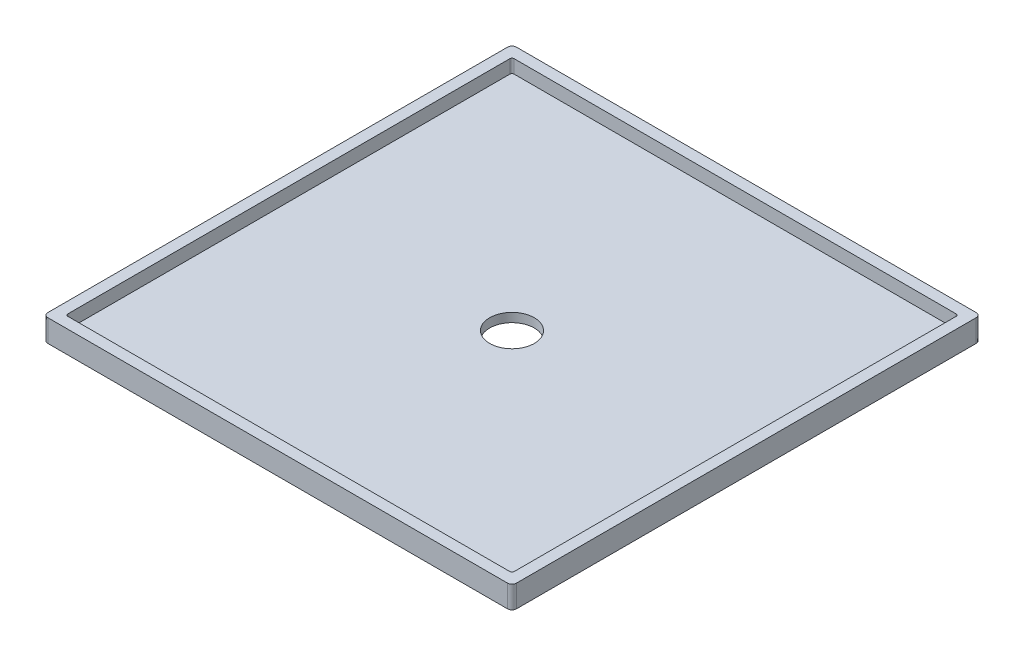
ISO-10303-21;
HEADER;
FILE_DESCRIPTION(('STEP AP214'),'2;1');
FILE_NAME('part.step','',(''),(''),'','','');
FILE_SCHEMA(('AUTOMOTIVE_DESIGN { 1 0 10303 214 1 1 1 1 }'));
ENDSEC;
DATA;
#1=APPLICATION_CONTEXT('core data for automotive mechanical design processes');
#2=APPLICATION_PROTOCOL_DEFINITION('international standard','automotive_design',2000,#1);
#3=PRODUCT_CONTEXT('',#1,'mechanical');
#4=PRODUCT('Part','Part','',(#3));
#5=PRODUCT_RELATED_PRODUCT_CATEGORY('part','',(#4));
#6=PRODUCT_DEFINITION_FORMATION('','',#4);
#7=PRODUCT_DEFINITION_CONTEXT('part definition',#1,'design');
#8=PRODUCT_DEFINITION('design','',#6,#7);
#9=PRODUCT_DEFINITION_SHAPE('','',#8);
#10=(LENGTH_UNIT() NAMED_UNIT(*) SI_UNIT(.MILLI.,.METRE.));
#11=(NAMED_UNIT(*) PLANE_ANGLE_UNIT() SI_UNIT($,.RADIAN.));
#12=(NAMED_UNIT(*) SI_UNIT($,.STERADIAN.) SOLID_ANGLE_UNIT());
#13=UNCERTAINTY_MEASURE_WITH_UNIT(LENGTH_MEASURE(1.E-05),#10,'distance_accuracy_value','');
#14=(GEOMETRIC_REPRESENTATION_CONTEXT(3) GLOBAL_UNCERTAINTY_ASSIGNED_CONTEXT((#13)) GLOBAL_UNIT_ASSIGNED_CONTEXT((#10,
#11,#12)) REPRESENTATION_CONTEXT('',''));
#15=CARTESIAN_POINT('',(0.,0.,0.));
#16=DIRECTION('',(0.,0.,1.));
#17=DIRECTION('',(1.,0.,0.));
#18=AXIS2_PLACEMENT_3D('',#15,#16,#17);
#19=CARTESIAN_POINT('',(52.5,5.,52.5));
#20=DIRECTION('',(-1.,0.,0.));
#21=DIRECTION('',(0.,0.,1.));
#22=AXIS2_PLACEMENT_3D('',#19,#20,#21);
#23=PLANE('',#22);
#24=DIRECTION('',(0.,0.,-1.));
#25=VECTOR('',#24,1.);
#26=CARTESIAN_POINT('',(52.5,0.,52.5));
#27=LINE('',#26,#25);
#28=CARTESIAN_POINT('',(52.5,0.,51.5));
#29=VERTEX_POINT('',#28);
#30=CARTESIAN_POINT('',(52.5,0.,-51.5));
#31=VERTEX_POINT('',#30);
#32=EDGE_CURVE('E226',#29,#31,#27,.T.);
#33=ORIENTED_EDGE('',*,*,#32,.T.);
#34=DIRECTION('',(0.,-1.,0.));
#35=VECTOR('',#34,1.);
#36=CARTESIAN_POINT('',(52.5,5.,-51.5));
#37=LINE('',#36,#35);
#38=CARTESIAN_POINT('',(52.5,5.,-51.5));
#39=VERTEX_POINT('',#38);
#40=EDGE_CURVE('E11',#31,#39,#37,.F.);
#41=ORIENTED_EDGE('',*,*,#40,.T.);
#42=DIRECTION('',(0.,0.,-1.));
#43=VECTOR('',#42,1.);
#44=CARTESIAN_POINT('',(52.5,5.,52.5));
#45=LINE('',#44,#43);
#46=CARTESIAN_POINT('',(52.5,5.,51.5));
#47=VERTEX_POINT('',#46);
#48=EDGE_CURVE('E227',#47,#39,#45,.T.);
#49=ORIENTED_EDGE('',*,*,#48,.F.);
#50=DIRECTION('',(0.,-1.,0.));
#51=VECTOR('',#50,1.);
#52=CARTESIAN_POINT('',(52.5,5.,51.5));
#53=LINE('',#52,#51);
#54=EDGE_CURVE('E41',#47,#29,#53,.T.);
#55=ORIENTED_EDGE('',*,*,#54,.T.);
#56=EDGE_LOOP('',(#33,#41,#49,#55));
#57=FACE_BOUND('',#56,.T.);
#58=ADVANCED_FACE('F33',(#57),#23,.F.);
#59=CARTESIAN_POINT('',(-52.5,5.,-52.5));
#60=DIRECTION('',(0.,0.,1.));
#61=DIRECTION('',(1.,0.,0.));
#62=AXIS2_PLACEMENT_3D('',#59,#60,#61);
#63=PLANE('',#62);
#64=DIRECTION('',(-1.,0.,0.));
#65=VECTOR('',#64,1.);
#66=CARTESIAN_POINT('',(-52.5,0.,-52.5));
#67=LINE('',#66,#65);
#68=CARTESIAN_POINT('',(51.5,0.,-52.5));
#69=VERTEX_POINT('',#68);
#70=CARTESIAN_POINT('',(-51.5,0.,-52.5));
#71=VERTEX_POINT('',#70);
#72=EDGE_CURVE('E241',#69,#71,#67,.T.);
#73=ORIENTED_EDGE('',*,*,#72,.T.);
#74=DIRECTION('',(0.,-1.,0.));
#75=VECTOR('',#74,1.);
#76=CARTESIAN_POINT('',(-51.5,5.,-52.5));
#77=LINE('',#76,#75);
#78=CARTESIAN_POINT('',(-51.5,5.,-52.5));
#79=VERTEX_POINT('',#78);
#80=EDGE_CURVE('E48',#71,#79,#77,.F.);
#81=ORIENTED_EDGE('',*,*,#80,.T.);
#82=DIRECTION('',(-1.,0.,0.));
#83=VECTOR('',#82,1.);
#84=CARTESIAN_POINT('',(-52.5,5.,-52.5));
#85=LINE('',#84,#83);
#86=CARTESIAN_POINT('',(51.5,5.,-52.5));
#87=VERTEX_POINT('',#86);
#88=EDGE_CURVE('E229',#87,#79,#85,.T.);
#89=ORIENTED_EDGE('',*,*,#88,.F.);
#90=DIRECTION('',(0.,-1.,0.));
#91=VECTOR('',#90,1.);
#92=CARTESIAN_POINT('',(51.5,5.,-52.5));
#93=LINE('',#92,#91);
#94=EDGE_CURVE('E274',#87,#69,#93,.T.);
#95=ORIENTED_EDGE('',*,*,#94,.T.);
#96=EDGE_LOOP('',(#73,#81,#89,#95));
#97=FACE_BOUND('',#96,.T.);
#98=ADVANCED_FACE('F292',(#97),#63,.F.);
#99=CARTESIAN_POINT('',(-52.5,5.,52.5));
#100=DIRECTION('',(1.,0.,0.));
#101=DIRECTION('',(0.,0.,-1.));
#102=AXIS2_PLACEMENT_3D('',#99,#100,#101);
#103=PLANE('',#102);
#104=DIRECTION('',(0.,0.,1.));
#105=VECTOR('',#104,1.);
#106=CARTESIAN_POINT('',(-52.5,0.,52.5));
#107=LINE('',#106,#105);
#108=CARTESIAN_POINT('',(-52.5,0.,-51.5));
#109=VERTEX_POINT('',#108);
#110=CARTESIAN_POINT('',(-52.5,0.,51.5));
#111=VERTEX_POINT('',#110);
#112=EDGE_CURVE('E243',#109,#111,#107,.T.);
#113=ORIENTED_EDGE('',*,*,#112,.T.);
#114=DIRECTION('',(0.,-1.,0.));
#115=VECTOR('',#114,1.);
#116=CARTESIAN_POINT('',(-52.5,5.,51.5));
#117=LINE('',#116,#115);
#118=CARTESIAN_POINT('',(-52.5,5.,51.5));
#119=VERTEX_POINT('',#118);
#120=EDGE_CURVE('E265',#111,#119,#117,.F.);
#121=ORIENTED_EDGE('',*,*,#120,.T.);
#122=DIRECTION('',(0.,0.,1.));
#123=VECTOR('',#122,1.);
#124=CARTESIAN_POINT('',(-52.5,5.,52.5));
#125=LINE('',#124,#123);
#126=CARTESIAN_POINT('',(-52.5,5.,-51.5));
#127=VERTEX_POINT('',#126);
#128=EDGE_CURVE('E232',#127,#119,#125,.T.);
#129=ORIENTED_EDGE('',*,*,#128,.F.);
#130=DIRECTION('',(0.,-1.,0.));
#131=VECTOR('',#130,1.);
#132=CARTESIAN_POINT('',(-52.5,5.,-51.5));
#133=LINE('',#132,#131);
#134=EDGE_CURVE('E262',#127,#109,#133,.T.);
#135=ORIENTED_EDGE('',*,*,#134,.T.);
#136=EDGE_LOOP('',(#113,#121,#129,#135));
#137=FACE_BOUND('',#136,.T.);
#138=ADVANCED_FACE('F301',(#137),#103,.F.);
#139=CARTESIAN_POINT('',(-52.5,5.,52.5));
#140=DIRECTION('',(0.,0.,-1.));
#141=DIRECTION('',(-1.,0.,0.));
#142=AXIS2_PLACEMENT_3D('',#139,#140,#141);
#143=PLANE('',#142);
#144=DIRECTION('',(1.,0.,0.));
#145=VECTOR('',#144,1.);
#146=CARTESIAN_POINT('',(-52.5,5.,52.5));
#147=LINE('',#146,#145);
#148=CARTESIAN_POINT('',(-51.5,5.,52.5));
#149=VERTEX_POINT('',#148);
#150=CARTESIAN_POINT('',(51.5,5.,52.5));
#151=VERTEX_POINT('',#150);
#152=EDGE_CURVE('E235',#149,#151,#147,.T.);
#153=ORIENTED_EDGE('',*,*,#152,.F.);
#154=DIRECTION('',(0.,-1.,0.));
#155=VECTOR('',#154,1.);
#156=CARTESIAN_POINT('',(-51.5,5.,52.5));
#157=LINE('',#156,#155);
#158=CARTESIAN_POINT('',(-51.5,0.,52.5));
#159=VERTEX_POINT('',#158);
#160=EDGE_CURVE('E251',#149,#159,#157,.T.);
#161=ORIENTED_EDGE('',*,*,#160,.T.);
#162=DIRECTION('',(1.,0.,0.));
#163=VECTOR('',#162,1.);
#164=CARTESIAN_POINT('',(-52.5,0.,52.5));
#165=LINE('',#164,#163);
#166=CARTESIAN_POINT('',(51.5,0.,52.5));
#167=VERTEX_POINT('',#166);
#168=EDGE_CURVE('E230',#159,#167,#165,.T.);
#169=ORIENTED_EDGE('',*,*,#168,.T.);
#170=DIRECTION('',(0.,-1.,0.));
#171=VECTOR('',#170,1.);
#172=CARTESIAN_POINT('',(51.5,5.,52.5));
#173=LINE('',#172,#171);
#174=EDGE_CURVE('E238',#167,#151,#173,.F.);
#175=ORIENTED_EDGE('',*,*,#174,.T.);
#176=EDGE_LOOP('',(#153,#161,#169,#175));
#177=FACE_BOUND('',#176,.T.);
#178=ADVANCED_FACE('F309',(#177),#143,.F.);
#179=CARTESIAN_POINT('',(0.,5.,0.));
#180=DIRECTION('',(0.,-1.,0.));
#181=DIRECTION('',(0.,0.,-1.));
#182=AXIS2_PLACEMENT_3D('',#179,#180,#181);
#183=PLANE('',#182);
#184=DIRECTION('',(-1.,0.,0.));
#185=VECTOR('',#184,1.);
#186=CARTESIAN_POINT('',(-49.5,5.,-50.));
#187=LINE('',#186,#185);
#188=CARTESIAN_POINT('',(49.5,5.,-50.));
#189=VERTEX_POINT('',#188);
#190=CARTESIAN_POINT('',(-49.5,5.,-50.));
#191=VERTEX_POINT('',#190);
#192=EDGE_CURVE('E193',#189,#191,#187,.T.);
#193=ORIENTED_EDGE('',*,*,#192,.F.);
#194=CARTESIAN_POINT('',(49.5,5.,-49.5));
#195=DIRECTION('',(0.,1.,0.));
#196=DIRECTION('',(0.,0.,-1.));
#197=AXIS2_PLACEMENT_3D('',#194,#195,#196);
#198=CIRCLE('',#197,0.5);
#199=CARTESIAN_POINT('',(50.,5.,-49.5));
#200=VERTEX_POINT('',#199);
#201=EDGE_CURVE('E154',#200,#189,#198,.T.);
#202=ORIENTED_EDGE('',*,*,#201,.F.);
#203=DIRECTION('',(0.,0.,-1.));
#204=VECTOR('',#203,1.);
#205=CARTESIAN_POINT('',(50.,5.,49.5));
#206=LINE('',#205,#204);
#207=CARTESIAN_POINT('',(50.,5.,49.5));
#208=VERTEX_POINT('',#207);
#209=EDGE_CURVE('E173',#208,#200,#206,.T.);
#210=ORIENTED_EDGE('',*,*,#209,.F.);
#211=CARTESIAN_POINT('',(49.5,5.,49.5));
#212=DIRECTION('',(0.,1.,0.));
#213=DIRECTION('',(0.,0.,1.));
#214=AXIS2_PLACEMENT_3D('',#211,#212,#213);
#215=CIRCLE('',#214,0.5);
#216=CARTESIAN_POINT('',(49.5,5.,50.));
#217=VERTEX_POINT('',#216);
#218=EDGE_CURVE('E176',#217,#208,#215,.T.);
#219=ORIENTED_EDGE('',*,*,#218,.F.);
#220=DIRECTION('',(1.,0.,0.));
#221=VECTOR('',#220,1.);
#222=CARTESIAN_POINT('',(-49.5,5.,50.));
#223=LINE('',#222,#221);
#224=CARTESIAN_POINT('',(-49.5,5.,50.));
#225=VERTEX_POINT('',#224);
#226=EDGE_CURVE('E204',#225,#217,#223,.T.);
#227=ORIENTED_EDGE('',*,*,#226,.F.);
#228=CARTESIAN_POINT('',(-49.5,5.,49.5));
#229=DIRECTION('',(0.,1.,0.));
#230=DIRECTION('',(0.,0.,-1.));
#231=AXIS2_PLACEMENT_3D('',#228,#229,#230);
#232=CIRCLE('',#231,0.5);
#233=CARTESIAN_POINT('',(-50.,5.,49.5));
#234=VERTEX_POINT('',#233);
#235=EDGE_CURVE('E201',#234,#225,#232,.T.);
#236=ORIENTED_EDGE('',*,*,#235,.F.);
#237=DIRECTION('',(0.,0.,1.));
#238=VECTOR('',#237,1.);
#239=CARTESIAN_POINT('',(-50.,5.,49.5));
#240=LINE('',#239,#238);
#241=CARTESIAN_POINT('',(-50.,5.,-49.5));
#242=VERTEX_POINT('',#241);
#243=EDGE_CURVE('E198',#242,#234,#240,.T.);
#244=ORIENTED_EDGE('',*,*,#243,.F.);
#245=CARTESIAN_POINT('',(-49.5,5.,-49.5));
#246=DIRECTION('',(0.,1.,0.));
#247=DIRECTION('',(0.,0.,-1.));
#248=AXIS2_PLACEMENT_3D('',#245,#246,#247);
#249=CIRCLE('',#248,0.5);
#250=EDGE_CURVE('E195',#191,#242,#249,.T.);
#251=ORIENTED_EDGE('',*,*,#250,.F.);
#252=EDGE_LOOP('',(#193,#202,#210,#219,#227,#236,#244,#251));
#253=FACE_BOUND('',#252,.T.);
#254=ORIENTED_EDGE('',*,*,#128,.T.);
#255=CARTESIAN_POINT('',(-51.5,5.,51.5));
#256=DIRECTION('',(0.,-1.,0.));
#257=DIRECTION('',(0.,0.,-1.));
#258=AXIS2_PLACEMENT_3D('',#255,#256,#257);
#259=CIRCLE('',#258,1.);
#260=EDGE_CURVE('E272',#119,#149,#259,.F.);
#261=ORIENTED_EDGE('',*,*,#260,.T.);
#262=ORIENTED_EDGE('',*,*,#152,.T.);
#263=CARTESIAN_POINT('',(51.5,5.,51.5));
#264=DIRECTION('',(0.,-1.,0.));
#265=DIRECTION('',(0.,0.,-1.));
#266=AXIS2_PLACEMENT_3D('',#263,#264,#265);
#267=CIRCLE('',#266,1.);
#268=EDGE_CURVE('E267',#151,#47,#267,.F.);
#269=ORIENTED_EDGE('',*,*,#268,.T.);
#270=ORIENTED_EDGE('',*,*,#48,.T.);
#271=CARTESIAN_POINT('',(51.5,5.,-51.5));
#272=DIRECTION('',(0.,-1.,0.));
#273=DIRECTION('',(0.,0.,-1.));
#274=AXIS2_PLACEMENT_3D('',#271,#272,#273);
#275=CIRCLE('',#274,1.);
#276=EDGE_CURVE('E55',#39,#87,#275,.F.);
#277=ORIENTED_EDGE('',*,*,#276,.T.);
#278=ORIENTED_EDGE('',*,*,#88,.T.);
#279=CARTESIAN_POINT('',(-51.5,5.,-51.5));
#280=DIRECTION('',(0.,-1.,0.));
#281=DIRECTION('',(0.,0.,-1.));
#282=AXIS2_PLACEMENT_3D('',#279,#280,#281);
#283=CIRCLE('',#282,1.);
#284=EDGE_CURVE('E270',#79,#127,#283,.F.);
#285=ORIENTED_EDGE('',*,*,#284,.T.);
#286=EDGE_LOOP('',(#254,#261,#262,#269,#270,#277,#278,#285));
#287=FACE_BOUND('',#286,.T.);
#288=ADVANCED_FACE('F294',(#253,#287),#183,.F.);
#289=CARTESIAN_POINT('',(0.,0.,0.));
#290=DIRECTION('',(0.,-1.,0.));
#291=DIRECTION('',(0.,0.,-1.));
#292=AXIS2_PLACEMENT_3D('',#289,#290,#291);
#293=PLANE('',#292);
#294=CARTESIAN_POINT('',(0.,0.,0.));
#295=DIRECTION('',(0.,-1.,0.));
#296=DIRECTION('',(0.,0.,-1.));
#297=AXIS2_PLACEMENT_3D('',#294,#295,#296);
#298=CIRCLE('',#297,5.);
#299=CARTESIAN_POINT('',(0.,0.,-5.));
#300=VERTEX_POINT('',#299);
#301=EDGE_CURVE('E223',#300,#300,#298,.F.);
#302=ORIENTED_EDGE('',*,*,#301,.T.);
#303=EDGE_LOOP('',(#302));
#304=FACE_BOUND('',#303,.T.);
#305=ORIENTED_EDGE('',*,*,#168,.F.);
#306=CARTESIAN_POINT('',(-51.5,0.,51.5));
#307=DIRECTION('',(0.,-1.,0.));
#308=DIRECTION('',(0.,0.,-1.));
#309=AXIS2_PLACEMENT_3D('',#306,#307,#308);
#310=CIRCLE('',#309,1.);
#311=EDGE_CURVE('E260',#159,#111,#310,.T.);
#312=ORIENTED_EDGE('',*,*,#311,.T.);
#313=ORIENTED_EDGE('',*,*,#112,.F.);
#314=CARTESIAN_POINT('',(-51.5,0.,-51.5));
#315=DIRECTION('',(0.,-1.,0.));
#316=DIRECTION('',(0.,0.,-1.));
#317=AXIS2_PLACEMENT_3D('',#314,#315,#316);
#318=CIRCLE('',#317,1.);
#319=EDGE_CURVE('E258',#109,#71,#318,.T.);
#320=ORIENTED_EDGE('',*,*,#319,.T.);
#321=ORIENTED_EDGE('',*,*,#72,.F.);
#322=CARTESIAN_POINT('',(51.5,0.,-51.5));
#323=DIRECTION('',(0.,-1.,0.));
#324=DIRECTION('',(0.,0.,-1.));
#325=AXIS2_PLACEMENT_3D('',#322,#323,#324);
#326=CIRCLE('',#325,1.);
#327=EDGE_CURVE('E256',#69,#31,#326,.T.);
#328=ORIENTED_EDGE('',*,*,#327,.T.);
#329=ORIENTED_EDGE('',*,*,#32,.F.);
#330=CARTESIAN_POINT('',(51.5,0.,51.5));
#331=DIRECTION('',(0.,-1.,0.));
#332=DIRECTION('',(0.,0.,-1.));
#333=AXIS2_PLACEMENT_3D('',#330,#331,#332);
#334=CIRCLE('',#333,1.);
#335=EDGE_CURVE('E254',#29,#167,#334,.T.);
#336=ORIENTED_EDGE('',*,*,#335,.T.);
#337=EDGE_LOOP('',(#305,#312,#313,#320,#321,#328,#329,#336));
#338=FACE_BOUND('',#337,.T.);
#339=ADVANCED_FACE('F287',(#304,#338),#293,.T.);
#340=CARTESIAN_POINT('',(0.,-14.1421356237309,0.));
#341=DIRECTION('',(0.,1.,0.));
#342=DIRECTION('',(0.,0.,1.));
#343=AXIS2_PLACEMENT_3D('',#340,#341,#342);
#344=CYLINDRICAL_SURFACE('',#343,5.);
#345=CARTESIAN_POINT('',(0.,2.,0.));
#346=DIRECTION('',(0.,-1.,0.));
#347=DIRECTION('',(0.,0.,-1.));
#348=AXIS2_PLACEMENT_3D('',#345,#346,#347);
#349=CIRCLE('',#348,5.);
#350=CARTESIAN_POINT('',(0.,2.,-5.));
#351=VERTEX_POINT('',#350);
#352=EDGE_CURVE('E211',#351,#351,#349,.F.);
#353=ORIENTED_EDGE('',*,*,#352,.T.);
#354=EDGE_LOOP('',(#353));
#355=FACE_BOUND('',#354,.T.);
#356=ORIENTED_EDGE('',*,*,#301,.F.);
#357=EDGE_LOOP('',(#356));
#358=FACE_BOUND('',#357,.T.);
#359=ADVANCED_FACE('F423',(#355,#358),#344,.F.);
#360=CARTESIAN_POINT('',(49.5,2.,-49.5));
#361=DIRECTION('',(0.,-1.,0.));
#362=DIRECTION('',(0.,0.,-1.));
#363=AXIS2_PLACEMENT_3D('',#360,#361,#362);
#364=PLANE('',#363);
#365=CARTESIAN_POINT('',(49.5,2.,-49.5));
#366=DIRECTION('',(0.,1.,0.));
#367=DIRECTION('',(0.,0.,-1.));
#368=AXIS2_PLACEMENT_3D('',#365,#366,#367);
#369=CIRCLE('',#368,0.5);
#370=CARTESIAN_POINT('',(50.,2.,-49.5));
#371=VERTEX_POINT('',#370);
#372=CARTESIAN_POINT('',(49.5,2.,-50.));
#373=VERTEX_POINT('',#372);
#374=EDGE_CURVE('E151',#371,#373,#369,.T.);
#375=ORIENTED_EDGE('',*,*,#374,.T.);
#376=DIRECTION('',(-1.,0.,0.));
#377=VECTOR('',#376,1.);
#378=CARTESIAN_POINT('',(-49.5,2.,-50.));
#379=LINE('',#378,#377);
#380=CARTESIAN_POINT('',(-49.5,2.,-50.));
#381=VERTEX_POINT('',#380);
#382=EDGE_CURVE('E162',#373,#381,#379,.T.);
#383=ORIENTED_EDGE('',*,*,#382,.T.);
#384=CARTESIAN_POINT('',(-49.5,2.,-49.5));
#385=DIRECTION('',(0.,1.,0.));
#386=DIRECTION('',(0.,0.,-1.));
#387=AXIS2_PLACEMENT_3D('',#384,#385,#386);
#388=CIRCLE('',#387,0.5);
#389=CARTESIAN_POINT('',(-50.,2.,-49.5));
#390=VERTEX_POINT('',#389);
#391=EDGE_CURVE('E167',#381,#390,#388,.T.);
#392=ORIENTED_EDGE('',*,*,#391,.T.);
#393=DIRECTION('',(0.,0.,1.));
#394=VECTOR('',#393,1.);
#395=CARTESIAN_POINT('',(-50.,2.,49.5));
#396=LINE('',#395,#394);
#397=CARTESIAN_POINT('',(-50.,2.,49.5));
#398=VERTEX_POINT('',#397);
#399=EDGE_CURVE('E180',#390,#398,#396,.T.);
#400=ORIENTED_EDGE('',*,*,#399,.T.);
#401=CARTESIAN_POINT('',(-49.5,2.,49.5));
#402=DIRECTION('',(0.,1.,0.));
#403=DIRECTION('',(0.,0.,-1.));
#404=AXIS2_PLACEMENT_3D('',#401,#402,#403);
#405=CIRCLE('',#404,0.5);
#406=CARTESIAN_POINT('',(-49.5,2.,50.));
#407=VERTEX_POINT('',#406);
#408=EDGE_CURVE('E183',#398,#407,#405,.T.);
#409=ORIENTED_EDGE('',*,*,#408,.T.);
#410=DIRECTION('',(1.,0.,0.));
#411=VECTOR('',#410,1.);
#412=CARTESIAN_POINT('',(-49.5,2.,50.));
#413=LINE('',#412,#411);
#414=CARTESIAN_POINT('',(49.5,2.,50.));
#415=VERTEX_POINT('',#414);
#416=EDGE_CURVE('E186',#407,#415,#413,.T.);
#417=ORIENTED_EDGE('',*,*,#416,.T.);
#418=CARTESIAN_POINT('',(49.5,2.,49.5));
#419=DIRECTION('',(0.,1.,0.));
#420=DIRECTION('',(0.,0.,1.));
#421=AXIS2_PLACEMENT_3D('',#418,#419,#420);
#422=CIRCLE('',#421,0.5);
#423=CARTESIAN_POINT('',(50.,2.,49.5));
#424=VERTEX_POINT('',#423);
#425=EDGE_CURVE('E189',#415,#424,#422,.T.);
#426=ORIENTED_EDGE('',*,*,#425,.T.);
#427=DIRECTION('',(0.,0.,-1.));
#428=VECTOR('',#427,1.);
#429=CARTESIAN_POINT('',(50.,2.,49.5));
#430=LINE('',#429,#428);
#431=EDGE_CURVE('E159',#424,#371,#430,.T.);
#432=ORIENTED_EDGE('',*,*,#431,.T.);
#433=EDGE_LOOP('',(#375,#383,#392,#400,#409,#417,#426,#432));
#434=FACE_BOUND('',#433,.T.);
#435=ORIENTED_EDGE('',*,*,#352,.F.);
#436=EDGE_LOOP('',(#435));
#437=FACE_BOUND('',#436,.T.);
#438=ADVANCED_FACE('F169',(#434,#437),#364,.F.);
#439=CARTESIAN_POINT('',(49.5,2.,-49.5));
#440=DIRECTION('',(0.,1.,0.));
#441=DIRECTION('',(0.,0.,1.));
#442=AXIS2_PLACEMENT_3D('',#439,#440,#441);
#443=CYLINDRICAL_SURFACE('',#442,0.5);
#444=ORIENTED_EDGE('',*,*,#201,.T.);
#445=DIRECTION('',(0.,1.,0.));
#446=VECTOR('',#445,1.);
#447=CARTESIAN_POINT('',(49.5,2.,-50.));
#448=LINE('',#447,#446);
#449=EDGE_CURVE('E147',#373,#189,#448,.T.);
#450=ORIENTED_EDGE('',*,*,#449,.F.);
#451=ORIENTED_EDGE('',*,*,#374,.F.);
#452=DIRECTION('',(0.,1.,0.));
#453=VECTOR('',#452,1.);
#454=CARTESIAN_POINT('',(50.,2.,-49.5));
#455=LINE('',#454,#453);
#456=EDGE_CURVE('E209',#371,#200,#455,.T.);
#457=ORIENTED_EDGE('',*,*,#456,.T.);
#458=EDGE_LOOP('',(#444,#450,#451,#457));
#459=FACE_BOUND('',#458,.T.);
#460=ADVANCED_FACE('F149',(#459),#443,.F.);
#461=CARTESIAN_POINT('',(50.,2.,49.5));
#462=DIRECTION('',(1.,0.,0.));
#463=DIRECTION('',(0.,0.,-1.));
#464=AXIS2_PLACEMENT_3D('',#461,#462,#463);
#465=PLANE('',#464);
#466=ORIENTED_EDGE('',*,*,#209,.T.);
#467=ORIENTED_EDGE('',*,*,#456,.F.);
#468=ORIENTED_EDGE('',*,*,#431,.F.);
#469=DIRECTION('',(0.,1.,0.));
#470=VECTOR('',#469,1.);
#471=CARTESIAN_POINT('',(50.,2.,49.5));
#472=LINE('',#471,#470);
#473=EDGE_CURVE('E212',#424,#208,#472,.T.);
#474=ORIENTED_EDGE('',*,*,#473,.T.);
#475=EDGE_LOOP('',(#466,#467,#468,#474));
#476=FACE_BOUND('',#475,.T.);
#477=ADVANCED_FACE('F399',(#476),#465,.F.);
#478=CARTESIAN_POINT('',(49.5,2.,49.5));
#479=DIRECTION('',(0.,1.,0.));
#480=DIRECTION('',(0.,0.,1.));
#481=AXIS2_PLACEMENT_3D('',#478,#479,#480);
#482=CYLINDRICAL_SURFACE('',#481,0.5);
#483=ORIENTED_EDGE('',*,*,#218,.T.);
#484=ORIENTED_EDGE('',*,*,#473,.F.);
#485=ORIENTED_EDGE('',*,*,#425,.F.);
#486=DIRECTION('',(0.,1.,0.));
#487=VECTOR('',#486,1.);
#488=CARTESIAN_POINT('',(49.5,2.,50.));
#489=LINE('',#488,#487);
#490=EDGE_CURVE('E214',#415,#217,#489,.T.);
#491=ORIENTED_EDGE('',*,*,#490,.T.);
#492=EDGE_LOOP('',(#483,#484,#485,#491));
#493=FACE_BOUND('',#492,.T.);
#494=ADVANCED_FACE('F390',(#493),#482,.F.);
#495=CARTESIAN_POINT('',(-49.5,2.,50.));
#496=DIRECTION('',(0.,0.,1.));
#497=DIRECTION('',(1.,0.,0.));
#498=AXIS2_PLACEMENT_3D('',#495,#496,#497);
#499=PLANE('',#498);
#500=ORIENTED_EDGE('',*,*,#226,.T.);
#501=ORIENTED_EDGE('',*,*,#490,.F.);
#502=ORIENTED_EDGE('',*,*,#416,.F.);
#503=DIRECTION('',(0.,1.,0.));
#504=VECTOR('',#503,1.);
#505=CARTESIAN_POINT('',(-49.5,2.,50.));
#506=LINE('',#505,#504);
#507=EDGE_CURVE('E216',#407,#225,#506,.T.);
#508=ORIENTED_EDGE('',*,*,#507,.T.);
#509=EDGE_LOOP('',(#500,#501,#502,#508));
#510=FACE_BOUND('',#509,.T.);
#511=ADVANCED_FACE('F381',(#510),#499,.F.);
#512=CARTESIAN_POINT('',(-49.5,2.,49.5));
#513=DIRECTION('',(0.,1.,0.));
#514=DIRECTION('',(0.,0.,1.));
#515=AXIS2_PLACEMENT_3D('',#512,#513,#514);
#516=CYLINDRICAL_SURFACE('',#515,0.5);
#517=ORIENTED_EDGE('',*,*,#235,.T.);
#518=ORIENTED_EDGE('',*,*,#507,.F.);
#519=ORIENTED_EDGE('',*,*,#408,.F.);
#520=DIRECTION('',(0.,1.,0.));
#521=VECTOR('',#520,1.);
#522=CARTESIAN_POINT('',(-50.,2.,49.5));
#523=LINE('',#522,#521);
#524=EDGE_CURVE('E218',#398,#234,#523,.T.);
#525=ORIENTED_EDGE('',*,*,#524,.T.);
#526=EDGE_LOOP('',(#517,#518,#519,#525));
#527=FACE_BOUND('',#526,.T.);
#528=ADVANCED_FACE('F372',(#527),#516,.F.);
#529=CARTESIAN_POINT('',(-50.,2.,49.5));
#530=DIRECTION('',(-1.,0.,0.));
#531=DIRECTION('',(0.,0.,1.));
#532=AXIS2_PLACEMENT_3D('',#529,#530,#531);
#533=PLANE('',#532);
#534=ORIENTED_EDGE('',*,*,#243,.T.);
#535=ORIENTED_EDGE('',*,*,#524,.F.);
#536=ORIENTED_EDGE('',*,*,#399,.F.);
#537=DIRECTION('',(0.,1.,0.));
#538=VECTOR('',#537,1.);
#539=CARTESIAN_POINT('',(-50.,2.,-49.5));
#540=LINE('',#539,#538);
#541=EDGE_CURVE('E220',#390,#242,#540,.T.);
#542=ORIENTED_EDGE('',*,*,#541,.T.);
#543=EDGE_LOOP('',(#534,#535,#536,#542));
#544=FACE_BOUND('',#543,.T.);
#545=ADVANCED_FACE('F363',(#544),#533,.F.);
#546=CARTESIAN_POINT('',(-49.5,2.,-49.5));
#547=DIRECTION('',(0.,1.,0.));
#548=DIRECTION('',(0.,0.,1.));
#549=AXIS2_PLACEMENT_3D('',#546,#547,#548);
#550=CYLINDRICAL_SURFACE('',#549,0.5);
#551=ORIENTED_EDGE('',*,*,#250,.T.);
#552=ORIENTED_EDGE('',*,*,#541,.F.);
#553=ORIENTED_EDGE('',*,*,#391,.F.);
#554=DIRECTION('',(0.,1.,0.));
#555=VECTOR('',#554,1.);
#556=CARTESIAN_POINT('',(-49.5,2.,-50.));
#557=LINE('',#556,#555);
#558=EDGE_CURVE('E158',#381,#191,#557,.T.);
#559=ORIENTED_EDGE('',*,*,#558,.T.);
#560=EDGE_LOOP('',(#551,#552,#553,#559));
#561=FACE_BOUND('',#560,.T.);
#562=ADVANCED_FACE('F355',(#561),#550,.F.);
#563=CARTESIAN_POINT('',(-49.5,2.,-50.));
#564=DIRECTION('',(0.,0.,-1.));
#565=DIRECTION('',(-1.,0.,0.));
#566=AXIS2_PLACEMENT_3D('',#563,#564,#565);
#567=PLANE('',#566);
#568=ORIENTED_EDGE('',*,*,#192,.T.);
#569=ORIENTED_EDGE('',*,*,#558,.F.);
#570=ORIENTED_EDGE('',*,*,#382,.F.);
#571=ORIENTED_EDGE('',*,*,#449,.T.);
#572=EDGE_LOOP('',(#568,#569,#570,#571));
#573=FACE_BOUND('',#572,.T.);
#574=ADVANCED_FACE('F163',(#573),#567,.F.);
#575=CARTESIAN_POINT('',(-51.5,5.,51.5));
#576=DIRECTION('',(0.,-1.,0.));
#577=DIRECTION('',(0.,0.,-1.));
#578=AXIS2_PLACEMENT_3D('',#575,#576,#577);
#579=CYLINDRICAL_SURFACE('',#578,1.);
#580=ORIENTED_EDGE('',*,*,#260,.F.);
#581=ORIENTED_EDGE('',*,*,#120,.F.);
#582=ORIENTED_EDGE('',*,*,#311,.F.);
#583=ORIENTED_EDGE('',*,*,#160,.F.);
#584=EDGE_LOOP('',(#580,#581,#582,#583));
#585=FACE_BOUND('',#584,.T.);
#586=ADVANCED_FACE('F306',(#585),#579,.T.);
#587=CARTESIAN_POINT('',(-51.5,5.,-51.5));
#588=DIRECTION('',(0.,-1.,0.));
#589=DIRECTION('',(0.,0.,-1.));
#590=AXIS2_PLACEMENT_3D('',#587,#588,#589);
#591=CYLINDRICAL_SURFACE('',#590,1.);
#592=ORIENTED_EDGE('',*,*,#284,.F.);
#593=ORIENTED_EDGE('',*,*,#80,.F.);
#594=ORIENTED_EDGE('',*,*,#319,.F.);
#595=ORIENTED_EDGE('',*,*,#134,.F.);
#596=EDGE_LOOP('',(#592,#593,#594,#595));
#597=FACE_BOUND('',#596,.T.);
#598=ADVANCED_FACE('F298',(#597),#591,.T.);
#599=CARTESIAN_POINT('',(51.5,5.,-51.5));
#600=DIRECTION('',(0.,-1.,0.));
#601=DIRECTION('',(0.,0.,-1.));
#602=AXIS2_PLACEMENT_3D('',#599,#600,#601);
#603=CYLINDRICAL_SURFACE('',#602,1.);
#604=ORIENTED_EDGE('',*,*,#276,.F.);
#605=ORIENTED_EDGE('',*,*,#40,.F.);
#606=ORIENTED_EDGE('',*,*,#327,.F.);
#607=ORIENTED_EDGE('',*,*,#94,.F.);
#608=EDGE_LOOP('',(#604,#605,#606,#607));
#609=FACE_BOUND('',#608,.T.);
#610=ADVANCED_FACE('F291',(#609),#603,.T.);
#611=CARTESIAN_POINT('',(51.5,5.,51.5));
#612=DIRECTION('',(0.,-1.,0.));
#613=DIRECTION('',(0.,0.,-1.));
#614=AXIS2_PLACEMENT_3D('',#611,#612,#613);
#615=CYLINDRICAL_SURFACE('',#614,1.);
#616=ORIENTED_EDGE('',*,*,#268,.F.);
#617=ORIENTED_EDGE('',*,*,#174,.F.);
#618=ORIENTED_EDGE('',*,*,#335,.F.);
#619=ORIENTED_EDGE('',*,*,#54,.F.);
#620=EDGE_LOOP('',(#616,#617,#618,#619));
#621=FACE_BOUND('',#620,.T.);
#622=ADVANCED_FACE('F35',(#621),#615,.T.);
#623=CLOSED_SHELL('',(#58,#98,#138,#178,#288,#339,#359,#438,#460,#477,#494,#511,#528,#545,#562,
#574,#586,#598,#610,#622));
#624=MANIFOLD_SOLID_BREP('B2',#623);
#625=ADVANCED_BREP_SHAPE_REPRESENTATION('',(#18,#624),#14);
#626=SHAPE_DEFINITION_REPRESENTATION(#9,#625);
ENDSEC;
END-ISO-10303-21;
